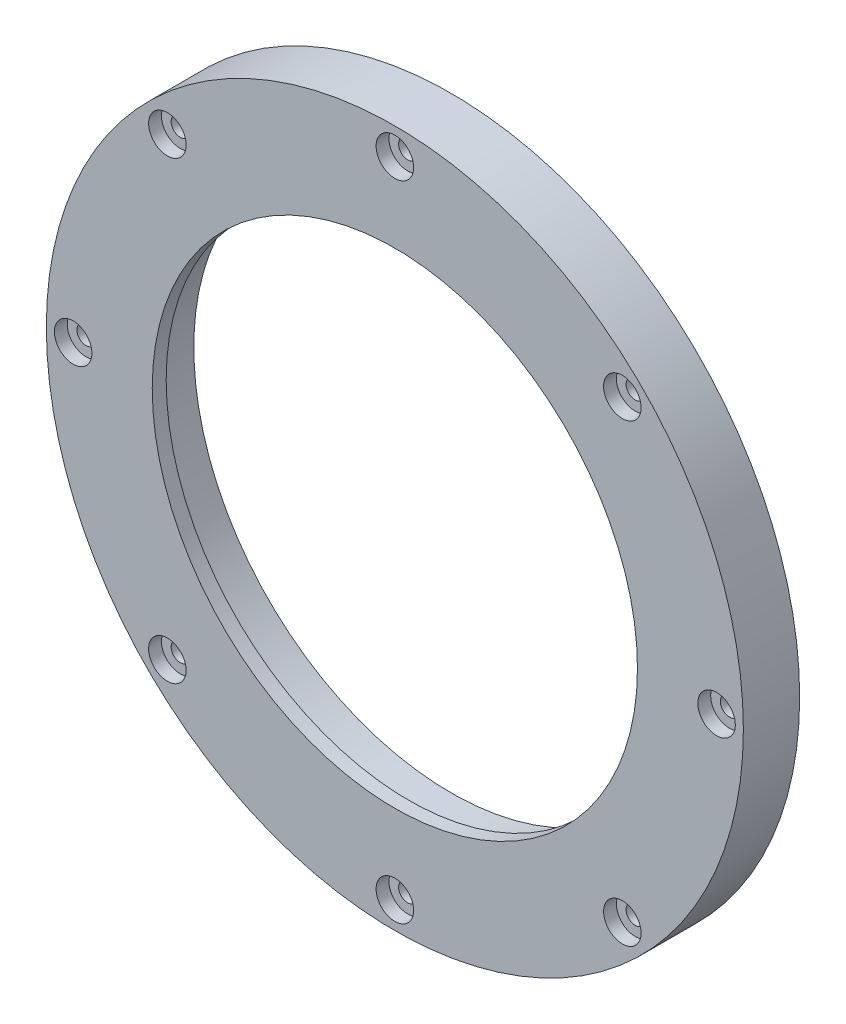
ISO-10303-21;
HEADER;
FILE_DESCRIPTION(('STEP AP214'),'2;1');
FILE_NAME('part.step','',(''),(''),'','','');
FILE_SCHEMA(('AUTOMOTIVE_DESIGN { 1 0 10303 214 1 1 1 1 }'));
ENDSEC;
DATA;
#1=APPLICATION_CONTEXT('core data for automotive mechanical design processes');
#2=APPLICATION_PROTOCOL_DEFINITION('international standard','automotive_design',2000,#1);
#3=PRODUCT_CONTEXT('',#1,'mechanical');
#4=PRODUCT('Part','Part','',(#3));
#5=PRODUCT_RELATED_PRODUCT_CATEGORY('part','',(#4));
#6=PRODUCT_DEFINITION_FORMATION('','',#4);
#7=PRODUCT_DEFINITION_CONTEXT('part definition',#1,'design');
#8=PRODUCT_DEFINITION('design','',#6,#7);
#9=PRODUCT_DEFINITION_SHAPE('','',#8);
#10=(LENGTH_UNIT() NAMED_UNIT(*) SI_UNIT(.MILLI.,.METRE.));
#11=(NAMED_UNIT(*) PLANE_ANGLE_UNIT() SI_UNIT($,.RADIAN.));
#12=(NAMED_UNIT(*) SI_UNIT($,.STERADIAN.) SOLID_ANGLE_UNIT());
#13=UNCERTAINTY_MEASURE_WITH_UNIT(LENGTH_MEASURE(1.E-05),#10,'distance_accuracy_value','');
#14=(GEOMETRIC_REPRESENTATION_CONTEXT(3) GLOBAL_UNCERTAINTY_ASSIGNED_CONTEXT((#13)) GLOBAL_UNIT_ASSIGNED_CONTEXT((#10,
#11,#12)) REPRESENTATION_CONTEXT('',''));
#15=CARTESIAN_POINT('',(0.,0.,0.));
#16=DIRECTION('',(0.,0.,1.));
#17=DIRECTION('',(1.,0.,0.));
#18=AXIS2_PLACEMENT_3D('',#15,#16,#17);
#19=CARTESIAN_POINT('',(0.,0.,70.4));
#20=DIRECTION('',(0.,0.,1.));
#21=DIRECTION('',(1.,0.,0.));
#22=AXIS2_PLACEMENT_3D('',#19,#20,#21);
#23=PLANE('',#22);
#24=CARTESIAN_POINT('',(0.,0.,70.4));
#25=DIRECTION('',(0.,0.,1.));
#26=DIRECTION('',(1.,0.,0.));
#27=AXIS2_PLACEMENT_3D('',#24,#25,#26);
#28=CIRCLE('',#27,48.);
#29=CARTESIAN_POINT('',(48.,0.,70.4));
#30=VERTEX_POINT('',#29);
#31=EDGE_CURVE('E150',#30,#30,#28,.T.);
#32=ORIENTED_EDGE('',*,*,#31,.F.);
#33=EDGE_LOOP('',(#32));
#34=FACE_BOUND('',#33,.T.);
#35=CARTESIAN_POINT('',(0.,0.,70.4));
#36=DIRECTION('',(0.,0.,1.));
#37=DIRECTION('',(1.,0.,0.));
#38=AXIS2_PLACEMENT_3D('',#35,#36,#37);
#39=CIRCLE('',#38,45.25);
#40=CARTESIAN_POINT('',(-45.25,0.,70.4));
#41=VERTEX_POINT('',#40);
#42=EDGE_CURVE('E11',#41,#41,#39,.T.);
#43=ORIENTED_EDGE('',*,*,#42,.T.);
#44=EDGE_LOOP('',(#43));
#45=FACE_BOUND('',#44,.T.);
#46=ADVANCED_FACE('F34',(#34,#45),#23,.F.);
#47=CARTESIAN_POINT('',(0.,0.,73.));
#48=DIRECTION('',(0.,0.,1.));
#49=DIRECTION('',(1.,0.,0.));
#50=AXIS2_PLACEMENT_3D('',#47,#48,#49);
#51=PLANE('',#50);
#52=CARTESIAN_POINT('',(0.,60.,73.));
#53=DIRECTION('',(0.,0.,1.));
#54=DIRECTION('',(1.,0.,0.));
#55=AXIS2_PLACEMENT_3D('',#52,#53,#54);
#56=CIRCLE('',#55,3.5);
#57=CARTESIAN_POINT('',(3.5,60.,73.));
#58=VERTEX_POINT('',#57);
#59=EDGE_CURVE('E285',#58,#58,#56,.T.);
#60=ORIENTED_EDGE('',*,*,#59,.F.);
#61=EDGE_LOOP('',(#60));
#62=FACE_BOUND('',#61,.T.);
#63=CARTESIAN_POINT('',(42.4264068711935,42.4264068711945,73.));
#64=DIRECTION('',(0.,0.,1.));
#65=DIRECTION('',(1.,0.,0.));
#66=AXIS2_PLACEMENT_3D('',#63,#64,#65);
#67=CIRCLE('',#66,3.5);
#68=CARTESIAN_POINT('',(45.9264068711935,42.4264068711945,73.));
#69=VERTEX_POINT('',#68);
#70=EDGE_CURVE('E104',#69,#69,#67,.T.);
#71=ORIENTED_EDGE('',*,*,#70,.F.);
#72=EDGE_LOOP('',(#71));
#73=FACE_BOUND('',#72,.T.);
#74=CARTESIAN_POINT('',(60.0000000000023,2.33499385361515E-12,73.));
#75=DIRECTION('',(0.,0.,1.));
#76=DIRECTION('',(1.,0.,0.));
#77=AXIS2_PLACEMENT_3D('',#74,#75,#76);
#78=CIRCLE('',#77,3.5);
#79=CARTESIAN_POINT('',(63.5000000000023,2.33499385361515E-12,73.));
#80=VERTEX_POINT('',#79);
#81=EDGE_CURVE('E91',#80,#80,#78,.T.);
#82=ORIENTED_EDGE('',*,*,#81,.F.);
#83=EDGE_LOOP('',(#82));
#84=FACE_BOUND('',#83,.T.);
#85=CARTESIAN_POINT('',(42.4264068711968,-42.4264068711912,73.));
#86=DIRECTION('',(0.,0.,1.));
#87=DIRECTION('',(1.,0.,0.));
#88=AXIS2_PLACEMENT_3D('',#85,#86,#87);
#89=CIRCLE('',#88,3.5);
#90=CARTESIAN_POINT('',(45.9264068711968,-42.4264068711912,73.));
#91=VERTEX_POINT('',#90);
#92=EDGE_CURVE('E87',#91,#91,#89,.T.);
#93=ORIENTED_EDGE('',*,*,#92,.F.);
#94=EDGE_LOOP('',(#93));
#95=FACE_BOUND('',#94,.T.);
#96=CARTESIAN_POINT('',(4.6699877072303E-12,-60.,73.));
#97=DIRECTION('',(0.,0.,1.));
#98=DIRECTION('',(1.,0.,0.));
#99=AXIS2_PLACEMENT_3D('',#96,#97,#98);
#100=CIRCLE('',#99,3.5);
#101=CARTESIAN_POINT('',(3.50000000000467,-60.,73.));
#102=VERTEX_POINT('',#101);
#103=EDGE_CURVE('E83',#102,#102,#100,.T.);
#104=ORIENTED_EDGE('',*,*,#103,.F.);
#105=EDGE_LOOP('',(#104));
#106=FACE_BOUND('',#105,.T.);
#107=CARTESIAN_POINT('',(-42.4264068711889,-42.4264068711945,73.));
#108=DIRECTION('',(0.,0.,1.));
#109=DIRECTION('',(1.,0.,0.));
#110=AXIS2_PLACEMENT_3D('',#107,#108,#109);
#111=CIRCLE('',#110,3.5);
#112=CARTESIAN_POINT('',(-38.9264068711889,-42.4264068711945,73.));
#113=VERTEX_POINT('',#112);
#114=EDGE_CURVE('E78',#113,#113,#111,.T.);
#115=ORIENTED_EDGE('',*,*,#114,.F.);
#116=EDGE_LOOP('',(#115));
#117=FACE_BOUND('',#116,.T.);
#118=CARTESIAN_POINT('',(-59.9999999999977,-2.34234173441004E-12,73.));
#119=DIRECTION('',(0.,0.,1.));
#120=DIRECTION('',(1.,0.,0.));
#121=AXIS2_PLACEMENT_3D('',#118,#119,#120);
#122=CIRCLE('',#121,3.5);
#123=CARTESIAN_POINT('',(-56.4999999999977,-2.34234173441004E-12,73.));
#124=VERTEX_POINT('',#123);
#125=EDGE_CURVE('E73',#124,#124,#122,.T.);
#126=ORIENTED_EDGE('',*,*,#125,.F.);
#127=EDGE_LOOP('',(#126));
#128=FACE_BOUND('',#127,.T.);
#129=CARTESIAN_POINT('',(-42.4264068711922,42.4264068711912,73.));
#130=DIRECTION('',(0.,0.,1.));
#131=DIRECTION('',(1.,0.,0.));
#132=AXIS2_PLACEMENT_3D('',#129,#130,#131);
#133=CIRCLE('',#132,3.5);
#134=CARTESIAN_POINT('',(-38.9264068711922,42.4264068711912,73.));
#135=VERTEX_POINT('',#134);
#136=EDGE_CURVE('E68',#135,#135,#133,.T.);
#137=ORIENTED_EDGE('',*,*,#136,.F.);
#138=EDGE_LOOP('',(#137));
#139=FACE_BOUND('',#138,.T.);
#140=CARTESIAN_POINT('',(0.,0.,73.));
#141=DIRECTION('',(0.,0.,1.));
#142=DIRECTION('',(1.,0.,0.));
#143=AXIS2_PLACEMENT_3D('',#140,#141,#142);
#144=CIRCLE('',#143,65.);
#145=CARTESIAN_POINT('',(65.,0.,73.));
#146=VERTEX_POINT('',#145);
#147=EDGE_CURVE('E63',#146,#146,#144,.F.);
#148=ORIENTED_EDGE('',*,*,#147,.F.);
#149=EDGE_LOOP('',(#148));
#150=FACE_BOUND('',#149,.T.);
#151=CARTESIAN_POINT('',(0.,0.,73.));
#152=DIRECTION('',(0.,0.,-1.));
#153=DIRECTION('',(1.,0.,0.));
#154=AXIS2_PLACEMENT_3D('',#151,#152,#153);
#155=CIRCLE('',#154,45.25);
#156=CARTESIAN_POINT('',(-45.25,0.,73.));
#157=VERTEX_POINT('',#156);
#158=EDGE_CURVE('E44',#157,#157,#155,.T.);
#159=ORIENTED_EDGE('',*,*,#158,.T.);
#160=EDGE_LOOP('',(#159));
#161=FACE_BOUND('',#160,.T.);
#162=ADVANCED_FACE('F172',(#62,#73,#84,#95,#106,#117,#128,#139,#150,#161),#51,.T.);
#163=CARTESIAN_POINT('',(0.,0.,70.5));
#164=DIRECTION('',(0.,0.,1.));
#165=DIRECTION('',(1.,0.,0.));
#166=AXIS2_PLACEMENT_3D('',#163,#164,#165);
#167=CYLINDRICAL_SURFACE('',#166,45.25);
#168=ORIENTED_EDGE('',*,*,#42,.F.);
#169=DIRECTION('',(0.,0.,1.));
#170=VECTOR('',#169,1.);
#171=CARTESIAN_POINT('',(-45.25,0.,70.5));
#172=LINE('',#171,#170);
#173=EDGE_CURVE('E53',#41,#157,#172,.T.);
#174=ORIENTED_EDGE('',*,*,#173,.T.);
#175=ORIENTED_EDGE('',*,*,#158,.F.);
#176=ORIENTED_EDGE('',*,*,#173,.F.);
#177=EDGE_LOOP('',(#168,#174,#175,#176));
#178=FACE_BOUND('',#177,.T.);
#179=ADVANCED_FACE('F52',(#178),#167,.F.);
#180=CARTESIAN_POINT('',(0.,0.,62.5));
#181=DIRECTION('',(0.,0.,1.));
#182=DIRECTION('',(1.,0.,0.));
#183=AXIS2_PLACEMENT_3D('',#180,#181,#182);
#184=CYLINDRICAL_SURFACE('',#183,48.);
#185=ORIENTED_EDGE('',*,*,#31,.T.);
#186=EDGE_LOOP('',(#185));
#187=FACE_BOUND('',#186,.T.);
#188=CARTESIAN_POINT('',(0.,0.,62.5));
#189=DIRECTION('',(0.,0.,-1.));
#190=DIRECTION('',(1.,0.,0.));
#191=AXIS2_PLACEMENT_3D('',#188,#189,#190);
#192=CIRCLE('',#191,48.);
#193=CARTESIAN_POINT('',(48.,0.,62.5));
#194=VERTEX_POINT('',#193);
#195=EDGE_CURVE('E56',#194,#194,#192,.T.);
#196=ORIENTED_EDGE('',*,*,#195,.T.);
#197=EDGE_LOOP('',(#196));
#198=FACE_BOUND('',#197,.T.);
#199=ADVANCED_FACE('F36',(#187,#198),#184,.F.);
#200=CARTESIAN_POINT('',(0.,0.,62.5));
#201=DIRECTION('',(0.,0.,1.));
#202=DIRECTION('',(1.,0.,0.));
#203=AXIS2_PLACEMENT_3D('',#200,#201,#202);
#204=PLANE('',#203);
#205=CARTESIAN_POINT('',(0.,60.,62.5));
#206=DIRECTION('',(0.,0.,1.));
#207=DIRECTION('',(1.,0.,0.));
#208=AXIS2_PLACEMENT_3D('',#205,#206,#207);
#209=CIRCLE('',#208,1.69999999999999);
#210=CARTESIAN_POINT('',(1.69999999999999,60.,62.5));
#211=VERTEX_POINT('',#210);
#212=EDGE_CURVE('E38',#211,#211,#209,.T.);
#213=ORIENTED_EDGE('',*,*,#212,.T.);
#214=EDGE_LOOP('',(#213));
#215=FACE_BOUND('',#214,.T.);
#216=CARTESIAN_POINT('',(42.4264068711935,42.4264068711945,62.5));
#217=DIRECTION('',(0.,0.,1.));
#218=DIRECTION('',(1.,0.,0.));
#219=AXIS2_PLACEMENT_3D('',#216,#217,#218);
#220=CIRCLE('',#219,1.69999999999999);
#221=CARTESIAN_POINT('',(44.1264068711935,42.4264068711945,62.5));
#222=VERTEX_POINT('',#221);
#223=EDGE_CURVE('E89',#222,#222,#220,.T.);
#224=ORIENTED_EDGE('',*,*,#223,.T.);
#225=EDGE_LOOP('',(#224));
#226=FACE_BOUND('',#225,.T.);
#227=CARTESIAN_POINT('',(60.0000000000023,2.33499385361515E-12,62.5));
#228=DIRECTION('',(0.,0.,1.));
#229=DIRECTION('',(1.,0.,0.));
#230=AXIS2_PLACEMENT_3D('',#227,#228,#229);
#231=CIRCLE('',#230,1.69999999999999);
#232=CARTESIAN_POINT('',(61.7000000000023,2.33499385361515E-12,62.5));
#233=VERTEX_POINT('',#232);
#234=EDGE_CURVE('E85',#233,#233,#231,.T.);
#235=ORIENTED_EDGE('',*,*,#234,.T.);
#236=EDGE_LOOP('',(#235));
#237=FACE_BOUND('',#236,.T.);
#238=CARTESIAN_POINT('',(42.4264068711968,-42.4264068711912,62.5));
#239=DIRECTION('',(0.,0.,1.));
#240=DIRECTION('',(1.,0.,0.));
#241=AXIS2_PLACEMENT_3D('',#238,#239,#240);
#242=CIRCLE('',#241,1.69999999999999);
#243=CARTESIAN_POINT('',(44.1264068711968,-42.4264068711912,62.5));
#244=VERTEX_POINT('',#243);
#245=EDGE_CURVE('E80',#244,#244,#242,.T.);
#246=ORIENTED_EDGE('',*,*,#245,.T.);
#247=EDGE_LOOP('',(#246));
#248=FACE_BOUND('',#247,.T.);
#249=CARTESIAN_POINT('',(4.6699877072303E-12,-60.,62.5));
#250=DIRECTION('',(0.,0.,1.));
#251=DIRECTION('',(1.,0.,0.));
#252=AXIS2_PLACEMENT_3D('',#249,#250,#251);
#253=CIRCLE('',#252,1.69999999999999);
#254=CARTESIAN_POINT('',(1.70000000000466,-60.,62.5));
#255=VERTEX_POINT('',#254);
#256=EDGE_CURVE('E75',#255,#255,#253,.T.);
#257=ORIENTED_EDGE('',*,*,#256,.T.);
#258=EDGE_LOOP('',(#257));
#259=FACE_BOUND('',#258,.T.);
#260=CARTESIAN_POINT('',(-42.4264068711889,-42.4264068711945,62.5));
#261=DIRECTION('',(0.,0.,1.));
#262=DIRECTION('',(1.,0.,0.));
#263=AXIS2_PLACEMENT_3D('',#260,#261,#262);
#264=CIRCLE('',#263,1.69999999999999);
#265=CARTESIAN_POINT('',(-40.7264068711889,-42.4264068711945,62.5));
#266=VERTEX_POINT('',#265);
#267=EDGE_CURVE('E70',#266,#266,#264,.T.);
#268=ORIENTED_EDGE('',*,*,#267,.T.);
#269=EDGE_LOOP('',(#268));
#270=FACE_BOUND('',#269,.T.);
#271=CARTESIAN_POINT('',(-59.9999999999977,-2.34234173441004E-12,62.5));
#272=DIRECTION('',(0.,0.,1.));
#273=DIRECTION('',(1.,0.,0.));
#274=AXIS2_PLACEMENT_3D('',#271,#272,#273);
#275=CIRCLE('',#274,1.69999999999999);
#276=CARTESIAN_POINT('',(-58.2999999999977,-2.34234173441004E-12,62.5));
#277=VERTEX_POINT('',#276);
#278=EDGE_CURVE('E65',#277,#277,#275,.T.);
#279=ORIENTED_EDGE('',*,*,#278,.T.);
#280=EDGE_LOOP('',(#279));
#281=FACE_BOUND('',#280,.T.);
#282=CARTESIAN_POINT('',(-42.4264068711922,42.4264068711912,62.5));
#283=DIRECTION('',(0.,0.,1.));
#284=DIRECTION('',(1.,0.,0.));
#285=AXIS2_PLACEMENT_3D('',#282,#283,#284);
#286=CIRCLE('',#285,1.69999999999999);
#287=CARTESIAN_POINT('',(-40.7264068711922,42.4264068711912,62.5));
#288=VERTEX_POINT('',#287);
#289=EDGE_CURVE('E60',#288,#288,#286,.T.);
#290=ORIENTED_EDGE('',*,*,#289,.T.);
#291=EDGE_LOOP('',(#290));
#292=FACE_BOUND('',#291,.T.);
#293=ORIENTED_EDGE('',*,*,#195,.F.);
#294=EDGE_LOOP('',(#293));
#295=FACE_BOUND('',#294,.T.);
#296=CARTESIAN_POINT('',(0.,0.,62.5));
#297=DIRECTION('',(0.,0.,-1.));
#298=DIRECTION('',(-1.,0.,0.));
#299=AXIS2_PLACEMENT_3D('',#296,#297,#298);
#300=CIRCLE('',#299,65.);
#301=CARTESIAN_POINT('',(-65.,0.,62.5));
#302=VERTEX_POINT('',#301);
#303=EDGE_CURVE('E147',#302,#302,#300,.T.);
#304=ORIENTED_EDGE('',*,*,#303,.T.);
#305=EDGE_LOOP('',(#304));
#306=FACE_BOUND('',#305,.T.);
#307=ADVANCED_FACE('F158',(#215,#226,#237,#248,#259,#270,#281,#292,#295,#306),#204,.F.);
#308=CARTESIAN_POINT('',(0.,0.,256.847763108502));
#309=DIRECTION('',(0.,0.,-1.));
#310=DIRECTION('',(-1.,0.,0.));
#311=AXIS2_PLACEMENT_3D('',#308,#309,#310);
#312=CYLINDRICAL_SURFACE('',#311,65.);
#313=ORIENTED_EDGE('',*,*,#303,.F.);
#314=EDGE_LOOP('',(#313));
#315=FACE_BOUND('',#314,.T.);
#316=ORIENTED_EDGE('',*,*,#147,.T.);
#317=EDGE_LOOP('',(#316));
#318=FACE_BOUND('',#317,.T.);
#319=ADVANCED_FACE('F161',(#315,#318),#312,.T.);
#320=CARTESIAN_POINT('',(-42.4264068711922,42.4264068711912,73.));
#321=DIRECTION('',(0.,0.,1.));
#322=DIRECTION('',(1.,0.,0.));
#323=AXIS2_PLACEMENT_3D('',#320,#321,#322);
#324=CYLINDRICAL_SURFACE('',#323,1.69999999999999);
#325=CARTESIAN_POINT('',(-42.4264068711922,42.4264068711912,70.6));
#326=DIRECTION('',(0.,0.,1.));
#327=DIRECTION('',(1.,0.,0.));
#328=AXIS2_PLACEMENT_3D('',#325,#326,#327);
#329=CIRCLE('',#328,1.69999999999999);
#330=CARTESIAN_POINT('',(-40.7264068711922,42.4264068711912,70.6));
#331=VERTEX_POINT('',#330);
#332=EDGE_CURVE('E64',#331,#331,#329,.T.);
#333=ORIENTED_EDGE('',*,*,#332,.T.);
#334=EDGE_LOOP('',(#333));
#335=FACE_BOUND('',#334,.T.);
#336=ORIENTED_EDGE('',*,*,#289,.F.);
#337=EDGE_LOOP('',(#336));
#338=FACE_BOUND('',#337,.T.);
#339=ADVANCED_FACE('F168',(#335,#338),#324,.F.);
#340=CARTESIAN_POINT('',(-40.7264068711922,42.4264068711912,70.6));
#341=DIRECTION('',(0.,0.,-1.));
#342=DIRECTION('',(-1.,0.,0.));
#343=AXIS2_PLACEMENT_3D('',#340,#341,#342);
#344=PLANE('',#343);
#345=ORIENTED_EDGE('',*,*,#332,.F.);
#346=EDGE_LOOP('',(#345));
#347=FACE_BOUND('',#346,.T.);
#348=CARTESIAN_POINT('',(-42.4264068711922,42.4264068711912,70.6));
#349=DIRECTION('',(0.,0.,1.));
#350=DIRECTION('',(1.,0.,0.));
#351=AXIS2_PLACEMENT_3D('',#348,#349,#350);
#352=CIRCLE('',#351,3.5);
#353=CARTESIAN_POINT('',(-38.9264068711922,42.4264068711912,70.6));
#354=VERTEX_POINT('',#353);
#355=EDGE_CURVE('E142',#354,#354,#352,.T.);
#356=ORIENTED_EDGE('',*,*,#355,.T.);
#357=EDGE_LOOP('',(#356));
#358=FACE_BOUND('',#357,.T.);
#359=ADVANCED_FACE('F187',(#347,#358),#344,.F.);
#360=CARTESIAN_POINT('',(-42.4264068711922,42.4264068711912,73.));
#361=DIRECTION('',(0.,0.,1.));
#362=DIRECTION('',(1.,0.,0.));
#363=AXIS2_PLACEMENT_3D('',#360,#361,#362);
#364=CYLINDRICAL_SURFACE('',#363,3.5);
#365=ORIENTED_EDGE('',*,*,#355,.F.);
#366=EDGE_LOOP('',(#365));
#367=FACE_BOUND('',#366,.T.);
#368=ORIENTED_EDGE('',*,*,#136,.T.);
#369=EDGE_LOOP('',(#368));
#370=FACE_BOUND('',#369,.T.);
#371=ADVANCED_FACE('F191',(#367,#370),#364,.F.);
#372=CARTESIAN_POINT('',(-59.9999999999977,-2.34234173441004E-12,73.));
#373=DIRECTION('',(0.,0.,1.));
#374=DIRECTION('',(1.,0.,0.));
#375=AXIS2_PLACEMENT_3D('',#372,#373,#374);
#376=CYLINDRICAL_SURFACE('',#375,1.69999999999999);
#377=CARTESIAN_POINT('',(-59.9999999999977,-2.34234173441004E-12,70.6));
#378=DIRECTION('',(0.,0.,1.));
#379=DIRECTION('',(1.,0.,0.));
#380=AXIS2_PLACEMENT_3D('',#377,#378,#379);
#381=CIRCLE('',#380,1.69999999999999);
#382=CARTESIAN_POINT('',(-58.2999999999977,-2.34234173441004E-12,70.6));
#383=VERTEX_POINT('',#382);
#384=EDGE_CURVE('E69',#383,#383,#381,.T.);
#385=ORIENTED_EDGE('',*,*,#384,.T.);
#386=EDGE_LOOP('',(#385));
#387=FACE_BOUND('',#386,.T.);
#388=ORIENTED_EDGE('',*,*,#278,.F.);
#389=EDGE_LOOP('',(#388));
#390=FACE_BOUND('',#389,.T.);
#391=ADVANCED_FACE('F195',(#387,#390),#376,.F.);
#392=CARTESIAN_POINT('',(-58.2999999999977,-2.34234173441004E-12,70.6));
#393=DIRECTION('',(0.,0.,-1.));
#394=DIRECTION('',(-1.,0.,0.));
#395=AXIS2_PLACEMENT_3D('',#392,#393,#394);
#396=PLANE('',#395);
#397=ORIENTED_EDGE('',*,*,#384,.F.);
#398=EDGE_LOOP('',(#397));
#399=FACE_BOUND('',#398,.T.);
#400=CARTESIAN_POINT('',(-59.9999999999977,-2.34234173441004E-12,70.6));
#401=DIRECTION('',(0.,0.,1.));
#402=DIRECTION('',(1.,0.,0.));
#403=AXIS2_PLACEMENT_3D('',#400,#401,#402);
#404=CIRCLE('',#403,3.5);
#405=CARTESIAN_POINT('',(-56.4999999999977,-2.34234173441004E-12,70.6));
#406=VERTEX_POINT('',#405);
#407=EDGE_CURVE('E135',#406,#406,#404,.T.);
#408=ORIENTED_EDGE('',*,*,#407,.T.);
#409=EDGE_LOOP('',(#408));
#410=FACE_BOUND('',#409,.T.);
#411=ADVANCED_FACE('F199',(#399,#410),#396,.F.);
#412=CARTESIAN_POINT('',(-59.9999999999977,-2.34234173441004E-12,73.));
#413=DIRECTION('',(0.,0.,1.));
#414=DIRECTION('',(1.,0.,0.));
#415=AXIS2_PLACEMENT_3D('',#412,#413,#414);
#416=CYLINDRICAL_SURFACE('',#415,3.5);
#417=ORIENTED_EDGE('',*,*,#407,.F.);
#418=EDGE_LOOP('',(#417));
#419=FACE_BOUND('',#418,.T.);
#420=ORIENTED_EDGE('',*,*,#125,.T.);
#421=EDGE_LOOP('',(#420));
#422=FACE_BOUND('',#421,.T.);
#423=ADVANCED_FACE('F203',(#419,#422),#416,.F.);
#424=CARTESIAN_POINT('',(-42.4264068711889,-42.4264068711945,73.));
#425=DIRECTION('',(0.,0.,1.));
#426=DIRECTION('',(1.,0.,0.));
#427=AXIS2_PLACEMENT_3D('',#424,#425,#426);
#428=CYLINDRICAL_SURFACE('',#427,1.69999999999999);
#429=CARTESIAN_POINT('',(-42.4264068711889,-42.4264068711945,70.6));
#430=DIRECTION('',(0.,0.,1.));
#431=DIRECTION('',(1.,0.,0.));
#432=AXIS2_PLACEMENT_3D('',#429,#430,#431);
#433=CIRCLE('',#432,1.69999999999999);
#434=CARTESIAN_POINT('',(-40.7264068711889,-42.4264068711945,70.6));
#435=VERTEX_POINT('',#434);
#436=EDGE_CURVE('E74',#435,#435,#433,.T.);
#437=ORIENTED_EDGE('',*,*,#436,.T.);
#438=EDGE_LOOP('',(#437));
#439=FACE_BOUND('',#438,.T.);
#440=ORIENTED_EDGE('',*,*,#267,.F.);
#441=EDGE_LOOP('',(#440));
#442=FACE_BOUND('',#441,.T.);
#443=ADVANCED_FACE('F207',(#439,#442),#428,.F.);
#444=CARTESIAN_POINT('',(-40.7264068711889,-42.4264068711945,70.6));
#445=DIRECTION('',(0.,0.,-1.));
#446=DIRECTION('',(-1.,0.,0.));
#447=AXIS2_PLACEMENT_3D('',#444,#445,#446);
#448=PLANE('',#447);
#449=ORIENTED_EDGE('',*,*,#436,.F.);
#450=EDGE_LOOP('',(#449));
#451=FACE_BOUND('',#450,.T.);
#452=CARTESIAN_POINT('',(-42.4264068711889,-42.4264068711945,70.6));
#453=DIRECTION('',(0.,0.,1.));
#454=DIRECTION('',(1.,0.,0.));
#455=AXIS2_PLACEMENT_3D('',#452,#453,#454);
#456=CIRCLE('',#455,3.5);
#457=CARTESIAN_POINT('',(-38.9264068711889,-42.4264068711945,70.6));
#458=VERTEX_POINT('',#457);
#459=EDGE_CURVE('E128',#458,#458,#456,.T.);
#460=ORIENTED_EDGE('',*,*,#459,.T.);
#461=EDGE_LOOP('',(#460));
#462=FACE_BOUND('',#461,.T.);
#463=ADVANCED_FACE('F211',(#451,#462),#448,.F.);
#464=CARTESIAN_POINT('',(-42.4264068711889,-42.4264068711945,73.));
#465=DIRECTION('',(0.,0.,1.));
#466=DIRECTION('',(1.,0.,0.));
#467=AXIS2_PLACEMENT_3D('',#464,#465,#466);
#468=CYLINDRICAL_SURFACE('',#467,3.5);
#469=ORIENTED_EDGE('',*,*,#459,.F.);
#470=EDGE_LOOP('',(#469));
#471=FACE_BOUND('',#470,.T.);
#472=ORIENTED_EDGE('',*,*,#114,.T.);
#473=EDGE_LOOP('',(#472));
#474=FACE_BOUND('',#473,.T.);
#475=ADVANCED_FACE('F215',(#471,#474),#468,.F.);
#476=CARTESIAN_POINT('',(4.6699877072303E-12,-60.,73.));
#477=DIRECTION('',(0.,0.,1.));
#478=DIRECTION('',(1.,0.,0.));
#479=AXIS2_PLACEMENT_3D('',#476,#477,#478);
#480=CYLINDRICAL_SURFACE('',#479,1.69999999999999);
#481=CARTESIAN_POINT('',(4.6699877072303E-12,-60.,70.6));
#482=DIRECTION('',(0.,0.,1.));
#483=DIRECTION('',(1.,0.,0.));
#484=AXIS2_PLACEMENT_3D('',#481,#482,#483);
#485=CIRCLE('',#484,1.69999999999999);
#486=CARTESIAN_POINT('',(1.70000000000466,-60.,70.6));
#487=VERTEX_POINT('',#486);
#488=EDGE_CURVE('E79',#487,#487,#485,.T.);
#489=ORIENTED_EDGE('',*,*,#488,.T.);
#490=EDGE_LOOP('',(#489));
#491=FACE_BOUND('',#490,.T.);
#492=ORIENTED_EDGE('',*,*,#256,.F.);
#493=EDGE_LOOP('',(#492));
#494=FACE_BOUND('',#493,.T.);
#495=ADVANCED_FACE('F219',(#491,#494),#480,.F.);
#496=CARTESIAN_POINT('',(1.70000000000466,-60.,70.6));
#497=DIRECTION('',(0.,0.,-1.));
#498=DIRECTION('',(-1.,0.,0.));
#499=AXIS2_PLACEMENT_3D('',#496,#497,#498);
#500=PLANE('',#499);
#501=ORIENTED_EDGE('',*,*,#488,.F.);
#502=EDGE_LOOP('',(#501));
#503=FACE_BOUND('',#502,.T.);
#504=CARTESIAN_POINT('',(4.6699877072303E-12,-60.,70.6));
#505=DIRECTION('',(0.,0.,1.));
#506=DIRECTION('',(1.,0.,0.));
#507=AXIS2_PLACEMENT_3D('',#504,#505,#506);
#508=CIRCLE('',#507,3.5);
#509=CARTESIAN_POINT('',(3.50000000000467,-60.,70.6));
#510=VERTEX_POINT('',#509);
#511=EDGE_CURVE('E121',#510,#510,#508,.T.);
#512=ORIENTED_EDGE('',*,*,#511,.T.);
#513=EDGE_LOOP('',(#512));
#514=FACE_BOUND('',#513,.T.);
#515=ADVANCED_FACE('F223',(#503,#514),#500,.F.);
#516=CARTESIAN_POINT('',(4.6699877072303E-12,-60.,73.));
#517=DIRECTION('',(0.,0.,1.));
#518=DIRECTION('',(1.,0.,0.));
#519=AXIS2_PLACEMENT_3D('',#516,#517,#518);
#520=CYLINDRICAL_SURFACE('',#519,3.5);
#521=ORIENTED_EDGE('',*,*,#511,.F.);
#522=EDGE_LOOP('',(#521));
#523=FACE_BOUND('',#522,.T.);
#524=ORIENTED_EDGE('',*,*,#103,.T.);
#525=EDGE_LOOP('',(#524));
#526=FACE_BOUND('',#525,.T.);
#527=ADVANCED_FACE('F227',(#523,#526),#520,.F.);
#528=CARTESIAN_POINT('',(42.4264068711968,-42.4264068711912,73.));
#529=DIRECTION('',(0.,0.,1.));
#530=DIRECTION('',(1.,0.,0.));
#531=AXIS2_PLACEMENT_3D('',#528,#529,#530);
#532=CYLINDRICAL_SURFACE('',#531,1.69999999999999);
#533=CARTESIAN_POINT('',(42.4264068711968,-42.4264068711912,70.6));
#534=DIRECTION('',(0.,0.,1.));
#535=DIRECTION('',(1.,0.,0.));
#536=AXIS2_PLACEMENT_3D('',#533,#534,#535);
#537=CIRCLE('',#536,1.69999999999999);
#538=CARTESIAN_POINT('',(44.1264068711968,-42.4264068711912,70.6));
#539=VERTEX_POINT('',#538);
#540=EDGE_CURVE('E84',#539,#539,#537,.T.);
#541=ORIENTED_EDGE('',*,*,#540,.T.);
#542=EDGE_LOOP('',(#541));
#543=FACE_BOUND('',#542,.T.);
#544=ORIENTED_EDGE('',*,*,#245,.F.);
#545=EDGE_LOOP('',(#544));
#546=FACE_BOUND('',#545,.T.);
#547=ADVANCED_FACE('F231',(#543,#546),#532,.F.);
#548=CARTESIAN_POINT('',(44.1264068711968,-42.4264068711912,70.6));
#549=DIRECTION('',(0.,0.,-1.));
#550=DIRECTION('',(-1.,0.,0.));
#551=AXIS2_PLACEMENT_3D('',#548,#549,#550);
#552=PLANE('',#551);
#553=ORIENTED_EDGE('',*,*,#540,.F.);
#554=EDGE_LOOP('',(#553));
#555=FACE_BOUND('',#554,.T.);
#556=CARTESIAN_POINT('',(42.4264068711968,-42.4264068711912,70.6));
#557=DIRECTION('',(0.,0.,1.));
#558=DIRECTION('',(1.,0.,0.));
#559=AXIS2_PLACEMENT_3D('',#556,#557,#558);
#560=CIRCLE('',#559,3.5);
#561=CARTESIAN_POINT('',(45.9264068711968,-42.4264068711912,70.6));
#562=VERTEX_POINT('',#561);
#563=EDGE_CURVE('E114',#562,#562,#560,.T.);
#564=ORIENTED_EDGE('',*,*,#563,.T.);
#565=EDGE_LOOP('',(#564));
#566=FACE_BOUND('',#565,.T.);
#567=ADVANCED_FACE('F235',(#555,#566),#552,.F.);
#568=CARTESIAN_POINT('',(42.4264068711968,-42.4264068711912,73.));
#569=DIRECTION('',(0.,0.,1.));
#570=DIRECTION('',(1.,0.,0.));
#571=AXIS2_PLACEMENT_3D('',#568,#569,#570);
#572=CYLINDRICAL_SURFACE('',#571,3.5);
#573=ORIENTED_EDGE('',*,*,#563,.F.);
#574=EDGE_LOOP('',(#573));
#575=FACE_BOUND('',#574,.T.);
#576=ORIENTED_EDGE('',*,*,#92,.T.);
#577=EDGE_LOOP('',(#576));
#578=FACE_BOUND('',#577,.T.);
#579=ADVANCED_FACE('F239',(#575,#578),#572,.F.);
#580=CARTESIAN_POINT('',(60.0000000000023,2.33499385361515E-12,73.));
#581=DIRECTION('',(0.,0.,1.));
#582=DIRECTION('',(1.,0.,0.));
#583=AXIS2_PLACEMENT_3D('',#580,#581,#582);
#584=CYLINDRICAL_SURFACE('',#583,1.69999999999999);
#585=CARTESIAN_POINT('',(60.0000000000023,2.33499385361515E-12,70.6));
#586=DIRECTION('',(0.,0.,1.));
#587=DIRECTION('',(1.,0.,0.));
#588=AXIS2_PLACEMENT_3D('',#585,#586,#587);
#589=CIRCLE('',#588,1.69999999999999);
#590=CARTESIAN_POINT('',(61.7000000000023,2.33499385361515E-12,70.6));
#591=VERTEX_POINT('',#590);
#592=EDGE_CURVE('E88',#591,#591,#589,.T.);
#593=ORIENTED_EDGE('',*,*,#592,.T.);
#594=EDGE_LOOP('',(#593));
#595=FACE_BOUND('',#594,.T.);
#596=ORIENTED_EDGE('',*,*,#234,.F.);
#597=EDGE_LOOP('',(#596));
#598=FACE_BOUND('',#597,.T.);
#599=ADVANCED_FACE('F243',(#595,#598),#584,.F.);
#600=CARTESIAN_POINT('',(61.7000000000023,2.33499385361515E-12,70.6));
#601=DIRECTION('',(0.,0.,-1.));
#602=DIRECTION('',(-1.,0.,0.));
#603=AXIS2_PLACEMENT_3D('',#600,#601,#602);
#604=PLANE('',#603);
#605=ORIENTED_EDGE('',*,*,#592,.F.);
#606=EDGE_LOOP('',(#605));
#607=FACE_BOUND('',#606,.T.);
#608=CARTESIAN_POINT('',(60.0000000000023,2.33499385361515E-12,70.6));
#609=DIRECTION('',(0.,0.,1.));
#610=DIRECTION('',(1.,0.,0.));
#611=AXIS2_PLACEMENT_3D('',#608,#609,#610);
#612=CIRCLE('',#611,3.5);
#613=CARTESIAN_POINT('',(63.5000000000023,2.33499385361515E-12,70.6));
#614=VERTEX_POINT('',#613);
#615=EDGE_CURVE('E96',#614,#614,#612,.T.);
#616=ORIENTED_EDGE('',*,*,#615,.T.);
#617=EDGE_LOOP('',(#616));
#618=FACE_BOUND('',#617,.T.);
#619=ADVANCED_FACE('F247',(#607,#618),#604,.F.);
#620=CARTESIAN_POINT('',(60.0000000000023,2.33499385361515E-12,73.));
#621=DIRECTION('',(0.,0.,1.));
#622=DIRECTION('',(1.,0.,0.));
#623=AXIS2_PLACEMENT_3D('',#620,#621,#622);
#624=CYLINDRICAL_SURFACE('',#623,3.5);
#625=ORIENTED_EDGE('',*,*,#615,.F.);
#626=EDGE_LOOP('',(#625));
#627=FACE_BOUND('',#626,.T.);
#628=ORIENTED_EDGE('',*,*,#81,.T.);
#629=EDGE_LOOP('',(#628));
#630=FACE_BOUND('',#629,.T.);
#631=ADVANCED_FACE('F251',(#627,#630),#624,.F.);
#632=CARTESIAN_POINT('',(42.4264068711935,42.4264068711945,73.));
#633=DIRECTION('',(0.,0.,1.));
#634=DIRECTION('',(1.,0.,0.));
#635=AXIS2_PLACEMENT_3D('',#632,#633,#634);
#636=CYLINDRICAL_SURFACE('',#635,1.69999999999999);
#637=CARTESIAN_POINT('',(42.4264068711935,42.4264068711945,70.6));
#638=DIRECTION('',(0.,0.,1.));
#639=DIRECTION('',(1.,0.,0.));
#640=AXIS2_PLACEMENT_3D('',#637,#638,#639);
#641=CIRCLE('',#640,1.69999999999999);
#642=CARTESIAN_POINT('',(44.1264068711935,42.4264068711945,70.6));
#643=VERTEX_POINT('',#642);
#644=EDGE_CURVE('E92',#643,#643,#641,.T.);
#645=ORIENTED_EDGE('',*,*,#644,.T.);
#646=EDGE_LOOP('',(#645));
#647=FACE_BOUND('',#646,.T.);
#648=ORIENTED_EDGE('',*,*,#223,.F.);
#649=EDGE_LOOP('',(#648));
#650=FACE_BOUND('',#649,.T.);
#651=ADVANCED_FACE('F255',(#647,#650),#636,.F.);
#652=CARTESIAN_POINT('',(44.1264068711935,42.4264068711945,70.6));
#653=DIRECTION('',(0.,0.,-1.));
#654=DIRECTION('',(-1.,0.,0.));
#655=AXIS2_PLACEMENT_3D('',#652,#653,#654);
#656=PLANE('',#655);
#657=ORIENTED_EDGE('',*,*,#644,.F.);
#658=EDGE_LOOP('',(#657));
#659=FACE_BOUND('',#658,.T.);
#660=CARTESIAN_POINT('',(42.4264068711935,42.4264068711945,70.6));
#661=DIRECTION('',(0.,0.,1.));
#662=DIRECTION('',(1.,0.,0.));
#663=AXIS2_PLACEMENT_3D('',#660,#661,#662);
#664=CIRCLE('',#663,3.5);
#665=CARTESIAN_POINT('',(45.9264068711935,42.4264068711945,70.6));
#666=VERTEX_POINT('',#665);
#667=EDGE_CURVE('E99',#666,#666,#664,.T.);
#668=ORIENTED_EDGE('',*,*,#667,.T.);
#669=EDGE_LOOP('',(#668));
#670=FACE_BOUND('',#669,.T.);
#671=ADVANCED_FACE('F259',(#659,#670),#656,.F.);
#672=CARTESIAN_POINT('',(42.4264068711935,42.4264068711945,73.));
#673=DIRECTION('',(0.,0.,1.));
#674=DIRECTION('',(1.,0.,0.));
#675=AXIS2_PLACEMENT_3D('',#672,#673,#674);
#676=CYLINDRICAL_SURFACE('',#675,3.5);
#677=ORIENTED_EDGE('',*,*,#667,.F.);
#678=EDGE_LOOP('',(#677));
#679=FACE_BOUND('',#678,.T.);
#680=ORIENTED_EDGE('',*,*,#70,.T.);
#681=EDGE_LOOP('',(#680));
#682=FACE_BOUND('',#681,.T.);
#683=ADVANCED_FACE('F262',(#679,#682),#676,.F.);
#684=CARTESIAN_POINT('',(0.,60.,73.));
#685=DIRECTION('',(0.,0.,1.));
#686=DIRECTION('',(1.,0.,0.));
#687=AXIS2_PLACEMENT_3D('',#684,#685,#686);
#688=CYLINDRICAL_SURFACE('',#687,1.69999999999999);
#689=CARTESIAN_POINT('',(0.,60.,70.6));
#690=DIRECTION('',(0.,0.,1.));
#691=DIRECTION('',(1.,0.,0.));
#692=AXIS2_PLACEMENT_3D('',#689,#690,#691);
#693=CIRCLE('',#692,1.69999999999999);
#694=CARTESIAN_POINT('',(1.69999999999999,60.,70.6));
#695=VERTEX_POINT('',#694);
#696=EDGE_CURVE('E287',#695,#695,#693,.T.);
#697=ORIENTED_EDGE('',*,*,#696,.T.);
#698=EDGE_LOOP('',(#697));
#699=FACE_BOUND('',#698,.T.);
#700=ORIENTED_EDGE('',*,*,#212,.F.);
#701=EDGE_LOOP('',(#700));
#702=FACE_BOUND('',#701,.T.);
#703=ADVANCED_FACE('F266',(#699,#702),#688,.F.);
#704=CARTESIAN_POINT('',(1.69999999999999,60.,70.6));
#705=DIRECTION('',(0.,0.,-1.));
#706=DIRECTION('',(-1.,0.,0.));
#707=AXIS2_PLACEMENT_3D('',#704,#705,#706);
#708=PLANE('',#707);
#709=ORIENTED_EDGE('',*,*,#696,.F.);
#710=EDGE_LOOP('',(#709));
#711=FACE_BOUND('',#710,.T.);
#712=CARTESIAN_POINT('',(0.,60.,70.6));
#713=DIRECTION('',(0.,0.,1.));
#714=DIRECTION('',(1.,0.,0.));
#715=AXIS2_PLACEMENT_3D('',#712,#713,#714);
#716=CIRCLE('',#715,3.5);
#717=CARTESIAN_POINT('',(3.5,60.,70.6));
#718=VERTEX_POINT('',#717);
#719=EDGE_CURVE('E283',#718,#718,#716,.T.);
#720=ORIENTED_EDGE('',*,*,#719,.T.);
#721=EDGE_LOOP('',(#720));
#722=FACE_BOUND('',#721,.T.);
#723=ADVANCED_FACE('F270',(#711,#722),#708,.F.);
#724=CARTESIAN_POINT('',(0.,60.,73.));
#725=DIRECTION('',(0.,0.,1.));
#726=DIRECTION('',(1.,0.,0.));
#727=AXIS2_PLACEMENT_3D('',#724,#725,#726);
#728=CYLINDRICAL_SURFACE('',#727,3.5);
#729=ORIENTED_EDGE('',*,*,#719,.F.);
#730=EDGE_LOOP('',(#729));
#731=FACE_BOUND('',#730,.T.);
#732=ORIENTED_EDGE('',*,*,#59,.T.);
#733=EDGE_LOOP('',(#732));
#734=FACE_BOUND('',#733,.T.);
#735=ADVANCED_FACE('F274',(#731,#734),#728,.F.);
#736=CLOSED_SHELL('',(#46,#162,#179,#199,#307,#319,#339,#359,#371,#391,#411,#423,#443,#463,#475,
#495,#515,#527,#547,#567,#579,#599,#619,#631,#651,#671,#683,#703,#723,#735));
#737=MANIFOLD_SOLID_BREP('B2',#736);
#738=ADVANCED_BREP_SHAPE_REPRESENTATION('',(#18,#737),#14);
#739=SHAPE_DEFINITION_REPRESENTATION(#9,#738);
ENDSEC;
END-ISO-10303-21;
